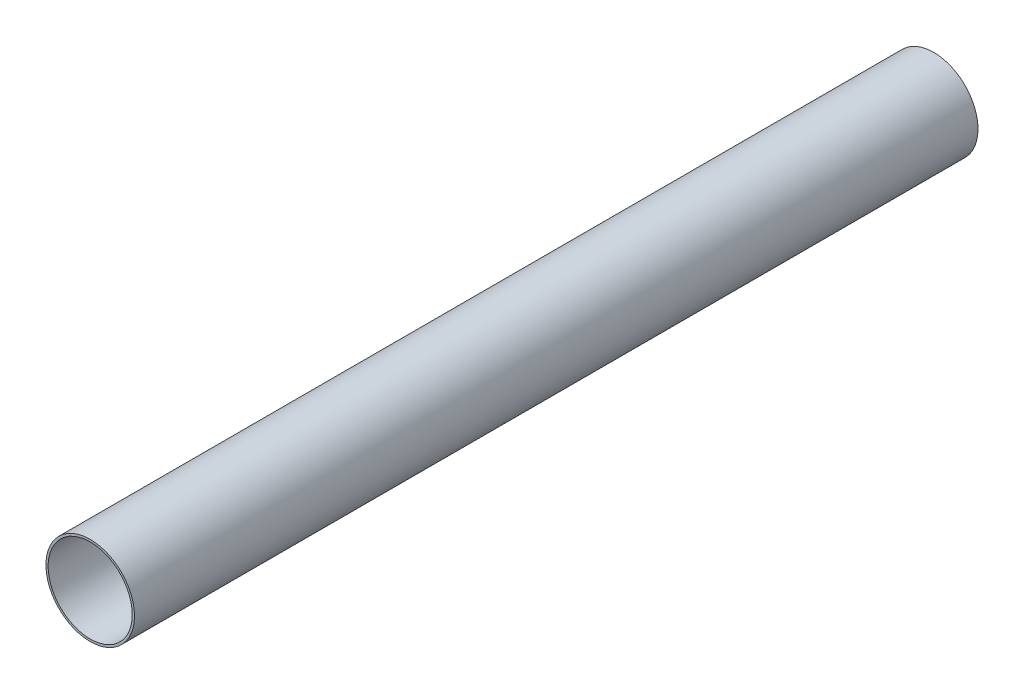
ISO-10303-21;
HEADER;
FILE_DESCRIPTION(('STEP AP214'),'2;1');
FILE_NAME('part.step','',(''),(''),'','','');
FILE_SCHEMA(('AUTOMOTIVE_DESIGN { 1 0 10303 214 1 1 1 1 }'));
ENDSEC;
DATA;
#1=APPLICATION_CONTEXT('core data for automotive mechanical design processes');
#2=APPLICATION_PROTOCOL_DEFINITION('international standard','automotive_design',2000,#1);
#3=PRODUCT_CONTEXT('',#1,'mechanical');
#4=PRODUCT('Part','Part','',(#3));
#5=PRODUCT_RELATED_PRODUCT_CATEGORY('part','',(#4));
#6=PRODUCT_DEFINITION_FORMATION('','',#4);
#7=PRODUCT_DEFINITION_CONTEXT('part definition',#1,'design');
#8=PRODUCT_DEFINITION('design','',#6,#7);
#9=PRODUCT_DEFINITION_SHAPE('','',#8);
#10=(LENGTH_UNIT() NAMED_UNIT(*) SI_UNIT(.MILLI.,.METRE.));
#11=(NAMED_UNIT(*) PLANE_ANGLE_UNIT() SI_UNIT($,.RADIAN.));
#12=(NAMED_UNIT(*) SI_UNIT($,.STERADIAN.) SOLID_ANGLE_UNIT());
#13=UNCERTAINTY_MEASURE_WITH_UNIT(LENGTH_MEASURE(1.E-05),#10,'distance_accuracy_value','');
#14=(GEOMETRIC_REPRESENTATION_CONTEXT(3) GLOBAL_UNCERTAINTY_ASSIGNED_CONTEXT((#13)) GLOBAL_UNIT_ASSIGNED_CONTEXT((#10,
#11,#12)) REPRESENTATION_CONTEXT('',''));
#15=CARTESIAN_POINT('',(0.,0.,0.));
#16=DIRECTION('',(0.,0.,1.));
#17=DIRECTION('',(1.,0.,0.));
#18=AXIS2_PLACEMENT_3D('',#15,#16,#17);
#19=CARTESIAN_POINT('',(0.,0.,1143.));
#20=DIRECTION('',(0.,0.,1.));
#21=DIRECTION('',(1.,0.,0.));
#22=AXIS2_PLACEMENT_3D('',#19,#20,#21);
#23=PLANE('',#22);
#24=CARTESIAN_POINT('',(0.,0.,1143.));
#25=DIRECTION('',(0.,0.,1.));
#26=DIRECTION('',(1.,0.,0.));
#27=AXIS2_PLACEMENT_3D('',#24,#25,#26);
#28=CIRCLE('',#27,60.);
#29=CARTESIAN_POINT('',(60.,0.,1143.));
#30=VERTEX_POINT('',#29);
#31=EDGE_CURVE('E10',#30,#30,#28,.T.);
#32=ORIENTED_EDGE('',*,*,#31,.T.);
#33=EDGE_LOOP('',(#32));
#34=FACE_BOUND('',#33,.T.);
#35=CARTESIAN_POINT('',(0.,0.,1143.));
#36=DIRECTION('',(0.,0.,1.));
#37=DIRECTION('',(1.,0.,0.));
#38=AXIS2_PLACEMENT_3D('',#35,#36,#37);
#39=CIRCLE('',#38,57.);
#40=CARTESIAN_POINT('',(57.,0.,1143.));
#41=VERTEX_POINT('',#40);
#42=EDGE_CURVE('E46',#41,#41,#39,.T.);
#43=ORIENTED_EDGE('',*,*,#42,.F.);
#44=EDGE_LOOP('',(#43));
#45=FACE_BOUND('',#44,.T.);
#46=ADVANCED_FACE('F35',(#34,#45),#23,.T.);
#47=CARTESIAN_POINT('',(0.,0.,0.));
#48=DIRECTION('',(0.,0.,1.));
#49=DIRECTION('',(1.,0.,0.));
#50=AXIS2_PLACEMENT_3D('',#47,#48,#49);
#51=PLANE('',#50);
#52=CARTESIAN_POINT('',(0.,0.,0.));
#53=DIRECTION('',(0.,0.,1.));
#54=DIRECTION('',(1.,0.,0.));
#55=AXIS2_PLACEMENT_3D('',#52,#53,#54);
#56=CIRCLE('',#55,60.);
#57=CARTESIAN_POINT('',(60.,0.,0.));
#58=VERTEX_POINT('',#57);
#59=EDGE_CURVE('E39',#58,#58,#56,.T.);
#60=ORIENTED_EDGE('',*,*,#59,.F.);
#61=EDGE_LOOP('',(#60));
#62=FACE_BOUND('',#61,.T.);
#63=CARTESIAN_POINT('',(0.,0.,0.));
#64=DIRECTION('',(0.,0.,1.));
#65=DIRECTION('',(1.,0.,0.));
#66=AXIS2_PLACEMENT_3D('',#63,#64,#65);
#67=CIRCLE('',#66,57.);
#68=CARTESIAN_POINT('',(57.,0.,0.));
#69=VERTEX_POINT('',#68);
#70=EDGE_CURVE('E48',#69,#69,#67,.T.);
#71=ORIENTED_EDGE('',*,*,#70,.T.);
#72=EDGE_LOOP('',(#71));
#73=FACE_BOUND('',#72,.T.);
#74=ADVANCED_FACE('F58',(#62,#73),#51,.F.);
#75=CARTESIAN_POINT('',(0.,0.,1143.));
#76=DIRECTION('',(0.,0.,-1.));
#77=DIRECTION('',(-1.,0.,0.));
#78=AXIS2_PLACEMENT_3D('',#75,#76,#77);
#79=CYLINDRICAL_SURFACE('',#78,60.);
#80=ORIENTED_EDGE('',*,*,#31,.F.);
#81=EDGE_LOOP('',(#80));
#82=FACE_BOUND('',#81,.T.);
#83=ORIENTED_EDGE('',*,*,#59,.T.);
#84=EDGE_LOOP('',(#83));
#85=FACE_BOUND('',#84,.T.);
#86=ADVANCED_FACE('F37',(#82,#85),#79,.T.);
#87=CARTESIAN_POINT('',(0.,0.,1143.));
#88=DIRECTION('',(0.,0.,-1.));
#89=DIRECTION('',(-1.,0.,0.));
#90=AXIS2_PLACEMENT_3D('',#87,#88,#89);
#91=CYLINDRICAL_SURFACE('',#90,57.);
#92=ORIENTED_EDGE('',*,*,#42,.T.);
#93=EDGE_LOOP('',(#92));
#94=FACE_BOUND('',#93,.T.);
#95=ORIENTED_EDGE('',*,*,#70,.F.);
#96=EDGE_LOOP('',(#95));
#97=FACE_BOUND('',#96,.T.);
#98=ADVANCED_FACE('F54',(#94,#97),#91,.F.);
#99=CLOSED_SHELL('',(#46,#74,#86,#98));
#100=MANIFOLD_SOLID_BREP('B2',#99);
#101=ADVANCED_BREP_SHAPE_REPRESENTATION('',(#18,#100),#14);
#102=SHAPE_DEFINITION_REPRESENTATION(#9,#101);
ENDSEC;
END-ISO-10303-21;
